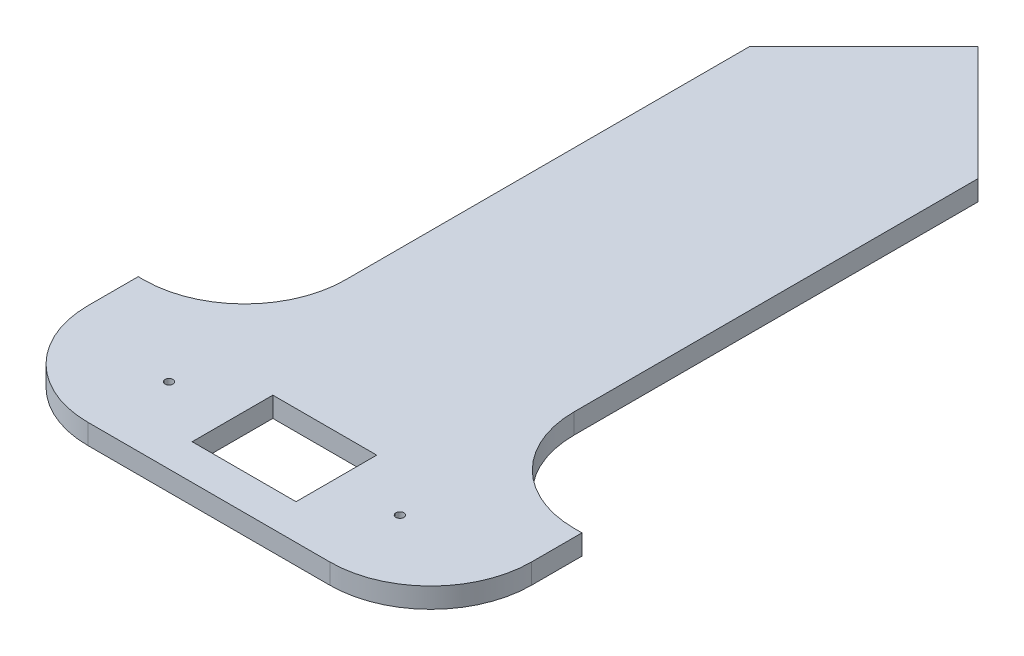
ISO-10303-21;
HEADER;
FILE_DESCRIPTION(('STEP AP214'),'2;1');
FILE_NAME('part.step','',(''),(''),'','','');
FILE_SCHEMA(('AUTOMOTIVE_DESIGN { 1 0 10303 214 1 1 1 1 }'));
ENDSEC;
DATA;
#1=APPLICATION_CONTEXT('core data for automotive mechanical design processes');
#2=APPLICATION_PROTOCOL_DEFINITION('international standard','automotive_design',2000,#1);
#3=PRODUCT_CONTEXT('',#1,'mechanical');
#4=PRODUCT('Part','Part','',(#3));
#5=PRODUCT_RELATED_PRODUCT_CATEGORY('part','',(#4));
#6=PRODUCT_DEFINITION_FORMATION('','',#4);
#7=PRODUCT_DEFINITION_CONTEXT('part definition',#1,'design');
#8=PRODUCT_DEFINITION('design','',#6,#7);
#9=PRODUCT_DEFINITION_SHAPE('','',#8);
#10=(LENGTH_UNIT() NAMED_UNIT(*) SI_UNIT(.MILLI.,.METRE.));
#11=(NAMED_UNIT(*) PLANE_ANGLE_UNIT() SI_UNIT($,.RADIAN.));
#12=(NAMED_UNIT(*) SI_UNIT($,.STERADIAN.) SOLID_ANGLE_UNIT());
#13=UNCERTAINTY_MEASURE_WITH_UNIT(LENGTH_MEASURE(1.E-05),#10,'distance_accuracy_value','');
#14=(GEOMETRIC_REPRESENTATION_CONTEXT(3) GLOBAL_UNCERTAINTY_ASSIGNED_CONTEXT((#13)) GLOBAL_UNIT_ASSIGNED_CONTEXT((#10,
#11,#12)) REPRESENTATION_CONTEXT('',''));
#15=CARTESIAN_POINT('',(0.,0.,0.));
#16=DIRECTION('',(0.,0.,1.));
#17=DIRECTION('',(1.,0.,0.));
#18=AXIS2_PLACEMENT_3D('',#15,#16,#17);
#19=CARTESIAN_POINT('',(0.,0.,0.));
#20=DIRECTION('',(0.,1.,0.));
#21=DIRECTION('',(0.,0.,1.));
#22=AXIS2_PLACEMENT_3D('',#19,#20,#21);
#23=PLANE('',#22);
#24=DIRECTION('',(1.,0.,0.));
#25=VECTOR('',#24,1.);
#26=CARTESIAN_POINT('',(-5.15,0.,4.));
#27=LINE('',#26,#25);
#28=CARTESIAN_POINT('',(-5.15,0.,4.));
#29=VERTEX_POINT('',#28);
#30=CARTESIAN_POINT('',(5.15,0.,4.));
#31=VERTEX_POINT('',#30);
#32=EDGE_CURVE('E223',#29,#31,#27,.T.);
#33=ORIENTED_EDGE('',*,*,#32,.T.);
#34=DIRECTION('',(0.,0.,-1.));
#35=VECTOR('',#34,1.);
#36=CARTESIAN_POINT('',(5.15,0.,-4.));
#37=LINE('',#36,#35);
#38=CARTESIAN_POINT('',(5.15,0.,-4.));
#39=VERTEX_POINT('',#38);
#40=EDGE_CURVE('E213',#31,#39,#37,.T.);
#41=ORIENTED_EDGE('',*,*,#40,.T.);
#42=DIRECTION('',(-1.,0.,0.));
#43=VECTOR('',#42,1.);
#44=CARTESIAN_POINT('',(-5.15,0.,-4.));
#45=LINE('',#44,#43);
#46=CARTESIAN_POINT('',(-5.15,0.,-4.));
#47=VERTEX_POINT('',#46);
#48=EDGE_CURVE('E216',#39,#47,#45,.T.);
#49=ORIENTED_EDGE('',*,*,#48,.T.);
#50=DIRECTION('',(0.,0.,1.));
#51=VECTOR('',#50,1.);
#52=CARTESIAN_POINT('',(-5.15,0.,-4.));
#53=LINE('',#52,#51);
#54=EDGE_CURVE('E220',#47,#29,#53,.T.);
#55=ORIENTED_EDGE('',*,*,#54,.T.);
#56=EDGE_LOOP('',(#33,#41,#49,#55));
#57=FACE_BOUND('',#56,.T.);
#58=CARTESIAN_POINT('',(-11.45,0.,0.));
#59=DIRECTION('',(0.,1.,0.));
#60=DIRECTION('',(0.,0.,1.));
#61=AXIS2_PLACEMENT_3D('',#58,#59,#60);
#62=CIRCLE('',#61,0.4);
#63=CARTESIAN_POINT('',(-11.45,0.,0.400000000000001));
#64=VERTEX_POINT('',#63);
#65=EDGE_CURVE('E207',#64,#64,#62,.T.);
#66=ORIENTED_EDGE('',*,*,#65,.T.);
#67=EDGE_LOOP('',(#66));
#68=FACE_BOUND('',#67,.T.);
#69=CARTESIAN_POINT('',(11.45,0.,0.));
#70=DIRECTION('',(0.,-1.,0.));
#71=DIRECTION('',(0.,0.,1.));
#72=AXIS2_PLACEMENT_3D('',#69,#70,#71);
#73=CIRCLE('',#72,0.4);
#74=CARTESIAN_POINT('',(11.45,0.,0.400000000000001));
#75=VERTEX_POINT('',#74);
#76=EDGE_CURVE('E201',#75,#75,#73,.T.);
#77=ORIENTED_EDGE('',*,*,#76,.F.);
#78=EDGE_LOOP('',(#77));
#79=FACE_BOUND('',#78,.T.);
#80=DIRECTION('',(0.,0.,-1.));
#81=VECTOR('',#80,1.);
#82=CARTESIAN_POINT('',(22.,0.,-7.5));
#83=LINE('',#82,#81);
#84=CARTESIAN_POINT('',(22.,0.,-2.50000000000001));
#85=VERTEX_POINT('',#84);
#86=CARTESIAN_POINT('',(22.,0.,-7.5));
#87=VERTEX_POINT('',#86);
#88=EDGE_CURVE('E238',#85,#87,#83,.T.);
#89=ORIENTED_EDGE('',*,*,#88,.F.);
#90=CARTESIAN_POINT('',(12.,0.,-2.5));
#91=DIRECTION('',(0.,1.,0.));
#92=DIRECTION('',(0.,0.,1.));
#93=AXIS2_PLACEMENT_3D('',#90,#91,#92);
#94=CIRCLE('',#93,10.);
#95=CARTESIAN_POINT('',(12.,0.,7.5));
#96=VERTEX_POINT('',#95);
#97=EDGE_CURVE('E293',#85,#96,#94,.F.);
#98=ORIENTED_EDGE('',*,*,#97,.T.);
#99=DIRECTION('',(1.,0.,0.));
#100=VECTOR('',#99,1.);
#101=CARTESIAN_POINT('',(-22.,0.,7.5));
#102=LINE('',#101,#100);
#103=CARTESIAN_POINT('',(-12.,0.,7.5));
#104=VERTEX_POINT('',#103);
#105=EDGE_CURVE('E248',#104,#96,#102,.T.);
#106=ORIENTED_EDGE('',*,*,#105,.F.);
#107=CARTESIAN_POINT('',(-12.,0.,-2.5));
#108=DIRECTION('',(0.,1.,0.));
#109=DIRECTION('',(0.,0.,1.));
#110=AXIS2_PLACEMENT_3D('',#107,#108,#109);
#111=CIRCLE('',#110,10.);
#112=CARTESIAN_POINT('',(-22.,0.,-2.5));
#113=VERTEX_POINT('',#112);
#114=EDGE_CURVE('E291',#104,#113,#111,.F.);
#115=ORIENTED_EDGE('',*,*,#114,.T.);
#116=DIRECTION('',(0.,0.,1.));
#117=VECTOR('',#116,1.);
#118=CARTESIAN_POINT('',(-22.,0.,-7.5));
#119=LINE('',#118,#117);
#120=CARTESIAN_POINT('',(-22.,0.,-7.5));
#121=VERTEX_POINT('',#120);
#122=EDGE_CURVE('E262',#121,#113,#119,.T.);
#123=ORIENTED_EDGE('',*,*,#122,.F.);
#124=DIRECTION('',(-1.,0.,0.));
#125=VECTOR('',#124,1.);
#126=CARTESIAN_POINT('',(-22.,0.,-7.5));
#127=LINE('',#126,#125);
#128=CARTESIAN_POINT('',(-21.45,0.,-7.5));
#129=VERTEX_POINT('',#128);
#130=EDGE_CURVE('E258',#129,#121,#127,.T.);
#131=ORIENTED_EDGE('',*,*,#130,.F.);
#132=CARTESIAN_POINT('',(-21.45,0.,-17.5));
#133=DIRECTION('',(0.,1.,0.));
#134=DIRECTION('',(0.,0.,1.));
#135=AXIS2_PLACEMENT_3D('',#132,#133,#134);
#136=CIRCLE('',#135,10.);
#137=CARTESIAN_POINT('',(-11.45,0.,-17.5));
#138=VERTEX_POINT('',#137);
#139=EDGE_CURVE('E285',#129,#138,#136,.T.);
#140=ORIENTED_EDGE('',*,*,#139,.T.);
#141=DIRECTION('',(0.,0.,1.));
#142=VECTOR('',#141,1.);
#143=CARTESIAN_POINT('',(-11.45,0.,-7.5));
#144=LINE('',#143,#142);
#145=CARTESIAN_POINT('',(-11.45,0.,-57.5517434185729));
#146=VERTEX_POINT('',#145);
#147=EDGE_CURVE('E171',#146,#138,#144,.T.);
#148=ORIENTED_EDGE('',*,*,#147,.F.);
#149=DIRECTION('',(-0.707106781186541,0.,0.707106781186554));
#150=VECTOR('',#149,1.);
#151=CARTESIAN_POINT('',(-0.116701530311687,0.,-68.8850418882614));
#152=LINE('',#151,#150);
#153=CARTESIAN_POINT('',(-0.116701530311693,0.,-68.8850418882614));
#154=VERTEX_POINT('',#153);
#155=EDGE_CURVE('E178',#154,#146,#152,.T.);
#156=ORIENTED_EDGE('',*,*,#155,.F.);
#157=DIRECTION('',(0.707106781186556,0.,0.707106781186539));
#158=VECTOR('',#157,1.);
#159=CARTESIAN_POINT('',(-0.116701530311691,0.,-68.8850418882614));
#160=LINE('',#159,#158);
#161=CARTESIAN_POINT('',(11.2165969393766,0.,-57.5517434185733));
#162=VERTEX_POINT('',#161);
#163=EDGE_CURVE('E174',#154,#162,#160,.T.);
#164=ORIENTED_EDGE('',*,*,#163,.T.);
#165=DIRECTION('',(0.,0.,-1.));
#166=VECTOR('',#165,1.);
#167=CARTESIAN_POINT('',(11.2165969393766,0.,-7.5));
#168=LINE('',#167,#166);
#169=CARTESIAN_POINT('',(11.2165969393766,0.,-17.5));
#170=VERTEX_POINT('',#169);
#171=EDGE_CURVE('E159',#170,#162,#168,.T.);
#172=ORIENTED_EDGE('',*,*,#171,.F.);
#173=CARTESIAN_POINT('',(21.2165969393766,0.,-17.5));
#174=DIRECTION('',(0.,1.,0.));
#175=DIRECTION('',(0.,0.,1.));
#176=AXIS2_PLACEMENT_3D('',#173,#174,#175);
#177=CIRCLE('',#176,10.);
#178=CARTESIAN_POINT('',(21.2165969393766,0.,-7.5));
#179=VERTEX_POINT('',#178);
#180=EDGE_CURVE('E281',#170,#179,#177,.T.);
#181=ORIENTED_EDGE('',*,*,#180,.T.);
#182=EDGE_CURVE('E259',#87,#179,#127,.T.);
#183=ORIENTED_EDGE('',*,*,#182,.F.);
#184=EDGE_LOOP('',(#89,#98,#106,#115,#123,#131,#140,#148,#156,#164,#172,#181,#183));
#185=FACE_BOUND('',#184,.T.);
#186=ADVANCED_FACE('F39',(#57,#68,#79,#185),#23,.F.);
#187=CARTESIAN_POINT('',(0.,2.,0.));
#188=DIRECTION('',(0.,1.,0.));
#189=DIRECTION('',(0.,0.,1.));
#190=AXIS2_PLACEMENT_3D('',#187,#188,#189);
#191=PLANE('',#190);
#192=DIRECTION('',(1.,0.,0.));
#193=VECTOR('',#192,1.);
#194=CARTESIAN_POINT('',(-22.,2.,7.5));
#195=LINE('',#194,#193);
#196=CARTESIAN_POINT('',(-12.,2.,7.5));
#197=VERTEX_POINT('',#196);
#198=CARTESIAN_POINT('',(12.,2.,7.5));
#199=VERTEX_POINT('',#198);
#200=EDGE_CURVE('E254',#197,#199,#195,.T.);
#201=ORIENTED_EDGE('',*,*,#200,.T.);
#202=CARTESIAN_POINT('',(12.,2.,-2.5));
#203=DIRECTION('',(0.,1.,0.));
#204=DIRECTION('',(0.,0.,1.));
#205=AXIS2_PLACEMENT_3D('',#202,#203,#204);
#206=CIRCLE('',#205,10.);
#207=CARTESIAN_POINT('',(22.,2.,-2.50000000000001));
#208=VERTEX_POINT('',#207);
#209=EDGE_CURVE('E47',#199,#208,#206,.T.);
#210=ORIENTED_EDGE('',*,*,#209,.T.);
#211=DIRECTION('',(0.,0.,-1.));
#212=VECTOR('',#211,1.);
#213=CARTESIAN_POINT('',(22.,2.,-7.5));
#214=LINE('',#213,#212);
#215=CARTESIAN_POINT('',(22.,2.,-7.5));
#216=VERTEX_POINT('',#215);
#217=EDGE_CURVE('E245',#208,#216,#214,.T.);
#218=ORIENTED_EDGE('',*,*,#217,.T.);
#219=DIRECTION('',(-1.,0.,0.));
#220=VECTOR('',#219,1.);
#221=CARTESIAN_POINT('',(-22.,2.,-7.5));
#222=LINE('',#221,#220);
#223=CARTESIAN_POINT('',(21.2165969393766,2.,-7.5));
#224=VERTEX_POINT('',#223);
#225=EDGE_CURVE('E249',#216,#224,#222,.T.);
#226=ORIENTED_EDGE('',*,*,#225,.T.);
#227=CARTESIAN_POINT('',(21.2165969393766,2.,-17.5));
#228=DIRECTION('',(0.,1.,0.));
#229=DIRECTION('',(0.,0.,1.));
#230=AXIS2_PLACEMENT_3D('',#227,#228,#229);
#231=CIRCLE('',#230,10.);
#232=CARTESIAN_POINT('',(11.2165969393766,2.,-17.5));
#233=VERTEX_POINT('',#232);
#234=EDGE_CURVE('E279',#224,#233,#231,.F.);
#235=ORIENTED_EDGE('',*,*,#234,.T.);
#236=DIRECTION('',(0.,0.,-1.));
#237=VECTOR('',#236,1.);
#238=CARTESIAN_POINT('',(11.2165969393766,2.,-7.5));
#239=LINE('',#238,#237);
#240=CARTESIAN_POINT('',(11.2165969393766,2.,-57.5517434185733));
#241=VERTEX_POINT('',#240);
#242=EDGE_CURVE('E197',#233,#241,#239,.T.);
#243=ORIENTED_EDGE('',*,*,#242,.T.);
#244=DIRECTION('',(0.707106781186556,0.,0.707106781186539));
#245=VECTOR('',#244,1.);
#246=CARTESIAN_POINT('',(-0.116701530311691,2.,-68.8850418882614));
#247=LINE('',#246,#245);
#248=CARTESIAN_POINT('',(-0.116701530311691,2.,-68.8850418882614));
#249=VERTEX_POINT('',#248);
#250=EDGE_CURVE('E185',#249,#241,#247,.T.);
#251=ORIENTED_EDGE('',*,*,#250,.F.);
#252=DIRECTION('',(-0.707106781186541,0.,0.707106781186554));
#253=VECTOR('',#252,1.);
#254=CARTESIAN_POINT('',(-0.116701530311687,2.,-68.8850418882614));
#255=LINE('',#254,#253);
#256=CARTESIAN_POINT('',(-11.45,2.,-57.5517434185729));
#257=VERTEX_POINT('',#256);
#258=EDGE_CURVE('E194',#249,#257,#255,.T.);
#259=ORIENTED_EDGE('',*,*,#258,.T.);
#260=DIRECTION('',(0.,0.,1.));
#261=VECTOR('',#260,1.);
#262=CARTESIAN_POINT('',(-11.45,2.,-7.5));
#263=LINE('',#262,#261);
#264=CARTESIAN_POINT('',(-11.45,2.,-17.5));
#265=VERTEX_POINT('',#264);
#266=EDGE_CURVE('E196',#257,#265,#263,.T.);
#267=ORIENTED_EDGE('',*,*,#266,.T.);
#268=CARTESIAN_POINT('',(-21.45,2.,-17.5));
#269=DIRECTION('',(0.,1.,0.));
#270=DIRECTION('',(0.,0.,1.));
#271=AXIS2_PLACEMENT_3D('',#268,#269,#270);
#272=CIRCLE('',#271,10.);
#273=CARTESIAN_POINT('',(-21.45,2.,-7.5));
#274=VERTEX_POINT('',#273);
#275=EDGE_CURVE('E283',#265,#274,#272,.F.);
#276=ORIENTED_EDGE('',*,*,#275,.T.);
#277=CARTESIAN_POINT('',(-22.,2.,-7.5));
#278=VERTEX_POINT('',#277);
#279=EDGE_CURVE('E247',#274,#278,#222,.T.);
#280=ORIENTED_EDGE('',*,*,#279,.T.);
#281=DIRECTION('',(0.,0.,1.));
#282=VECTOR('',#281,1.);
#283=CARTESIAN_POINT('',(-22.,2.,-7.5));
#284=LINE('',#283,#282);
#285=CARTESIAN_POINT('',(-22.,2.,-2.5));
#286=VERTEX_POINT('',#285);
#287=EDGE_CURVE('E252',#278,#286,#284,.T.);
#288=ORIENTED_EDGE('',*,*,#287,.T.);
#289=CARTESIAN_POINT('',(-12.,2.,-2.5));
#290=DIRECTION('',(0.,1.,0.));
#291=DIRECTION('',(0.,0.,1.));
#292=AXIS2_PLACEMENT_3D('',#289,#290,#291);
#293=CIRCLE('',#292,10.);
#294=EDGE_CURVE('E299',#286,#197,#293,.T.);
#295=ORIENTED_EDGE('',*,*,#294,.T.);
#296=EDGE_LOOP('',(#201,#210,#218,#226,#235,#243,#251,#259,#267,#276,#280,#288,#295));
#297=FACE_BOUND('',#296,.T.);
#298=CARTESIAN_POINT('',(11.45,2.,0.));
#299=DIRECTION('',(0.,-1.,0.));
#300=DIRECTION('',(0.,0.,1.));
#301=AXIS2_PLACEMENT_3D('',#298,#299,#300);
#302=CIRCLE('',#301,0.4);
#303=CARTESIAN_POINT('',(11.45,2.,0.400000000000001));
#304=VERTEX_POINT('',#303);
#305=EDGE_CURVE('E170',#304,#304,#302,.T.);
#306=ORIENTED_EDGE('',*,*,#305,.T.);
#307=EDGE_LOOP('',(#306));
#308=FACE_BOUND('',#307,.T.);
#309=CARTESIAN_POINT('',(-11.45,2.,0.));
#310=DIRECTION('',(0.,1.,0.));
#311=DIRECTION('',(0.,0.,1.));
#312=AXIS2_PLACEMENT_3D('',#309,#310,#311);
#313=CIRCLE('',#312,0.4);
#314=CARTESIAN_POINT('',(-11.45,2.,0.400000000000001));
#315=VERTEX_POINT('',#314);
#316=EDGE_CURVE('E204',#315,#315,#313,.T.);
#317=ORIENTED_EDGE('',*,*,#316,.F.);
#318=EDGE_LOOP('',(#317));
#319=FACE_BOUND('',#318,.T.);
#320=DIRECTION('',(0.,0.,-1.));
#321=VECTOR('',#320,1.);
#322=CARTESIAN_POINT('',(5.15,2.,-4.));
#323=LINE('',#322,#321);
#324=CARTESIAN_POINT('',(5.15,2.,4.));
#325=VERTEX_POINT('',#324);
#326=CARTESIAN_POINT('',(5.15,2.,-4.));
#327=VERTEX_POINT('',#326);
#328=EDGE_CURVE('E210',#325,#327,#323,.T.);
#329=ORIENTED_EDGE('',*,*,#328,.F.);
#330=DIRECTION('',(1.,0.,0.));
#331=VECTOR('',#330,1.);
#332=CARTESIAN_POINT('',(-5.15,2.,4.));
#333=LINE('',#332,#331);
#334=CARTESIAN_POINT('',(-5.15,2.,4.));
#335=VERTEX_POINT('',#334);
#336=EDGE_CURVE('E217',#335,#325,#333,.T.);
#337=ORIENTED_EDGE('',*,*,#336,.F.);
#338=DIRECTION('',(0.,0.,1.));
#339=VECTOR('',#338,1.);
#340=CARTESIAN_POINT('',(-5.15,2.,-4.));
#341=LINE('',#340,#339);
#342=CARTESIAN_POINT('',(-5.15,2.,-4.));
#343=VERTEX_POINT('',#342);
#344=EDGE_CURVE('E231',#343,#335,#341,.T.);
#345=ORIENTED_EDGE('',*,*,#344,.F.);
#346=DIRECTION('',(-1.,0.,0.));
#347=VECTOR('',#346,1.);
#348=CARTESIAN_POINT('',(-5.15,2.,-4.));
#349=LINE('',#348,#347);
#350=EDGE_CURVE('E228',#327,#343,#349,.T.);
#351=ORIENTED_EDGE('',*,*,#350,.F.);
#352=EDGE_LOOP('',(#329,#337,#345,#351));
#353=FACE_BOUND('',#352,.T.);
#354=ADVANCED_FACE('F303',(#297,#308,#319,#353),#191,.T.);
#355=CARTESIAN_POINT('',(-11.45,0.,-7.5));
#356=DIRECTION('',(-1.,0.,0.));
#357=DIRECTION('',(0.,0.,1.));
#358=AXIS2_PLACEMENT_3D('',#355,#356,#357);
#359=PLANE('',#358);
#360=ORIENTED_EDGE('',*,*,#266,.F.);
#361=DIRECTION('',(0.,-1.,0.));
#362=VECTOR('',#361,1.);
#363=CARTESIAN_POINT('',(-11.45,112.217644233689,-57.5517434185729));
#364=LINE('',#363,#362);
#365=EDGE_CURVE('E190',#257,#146,#364,.T.);
#366=ORIENTED_EDGE('',*,*,#365,.T.);
#367=ORIENTED_EDGE('',*,*,#147,.T.);
#368=DIRECTION('',(0.,1.,0.));
#369=VECTOR('',#368,1.);
#370=CARTESIAN_POINT('',(-11.45,0.,-17.5));
#371=LINE('',#370,#369);
#372=EDGE_CURVE('E274',#138,#265,#371,.T.);
#373=ORIENTED_EDGE('',*,*,#372,.T.);
#374=EDGE_LOOP('',(#360,#366,#367,#373));
#375=FACE_BOUND('',#374,.T.);
#376=ADVANCED_FACE('F333',(#375),#359,.T.);
#377=CARTESIAN_POINT('',(-22.,2.,-7.5));
#378=DIRECTION('',(0.,0.,1.));
#379=DIRECTION('',(1.,0.,0.));
#380=AXIS2_PLACEMENT_3D('',#377,#378,#379);
#381=PLANE('',#380);
#382=ORIENTED_EDGE('',*,*,#279,.F.);
#383=DIRECTION('',(0.,1.,0.));
#384=VECTOR('',#383,1.);
#385=CARTESIAN_POINT('',(-21.45,2.,-7.5));
#386=LINE('',#385,#384);
#387=EDGE_CURVE('E277',#274,#129,#386,.F.);
#388=ORIENTED_EDGE('',*,*,#387,.T.);
#389=ORIENTED_EDGE('',*,*,#130,.T.);
#390=DIRECTION('',(0.,-1.,0.));
#391=VECTOR('',#390,1.);
#392=CARTESIAN_POINT('',(-22.,2.,-7.5));
#393=LINE('',#392,#391);
#394=EDGE_CURVE('E256',#278,#121,#393,.T.);
#395=ORIENTED_EDGE('',*,*,#394,.F.);
#396=EDGE_LOOP('',(#382,#388,#389,#395));
#397=FACE_BOUND('',#396,.T.);
#398=ADVANCED_FACE('F324',(#397),#381,.F.);
#399=CARTESIAN_POINT('',(22.,2.,-7.5));
#400=DIRECTION('',(-1.,0.,0.));
#401=DIRECTION('',(0.,0.,1.));
#402=AXIS2_PLACEMENT_3D('',#399,#400,#401);
#403=PLANE('',#402);
#404=ORIENTED_EDGE('',*,*,#217,.F.);
#405=DIRECTION('',(0.,-1.,0.));
#406=VECTOR('',#405,1.);
#407=CARTESIAN_POINT('',(22.,2.,-2.50000000000001));
#408=LINE('',#407,#406);
#409=EDGE_CURVE('E288',#208,#85,#408,.T.);
#410=ORIENTED_EDGE('',*,*,#409,.T.);
#411=ORIENTED_EDGE('',*,*,#88,.T.);
#412=DIRECTION('',(0.,-1.,0.));
#413=VECTOR('',#412,1.);
#414=CARTESIAN_POINT('',(22.,2.,-7.5));
#415=LINE('',#414,#413);
#416=EDGE_CURVE('E267',#216,#87,#415,.T.);
#417=ORIENTED_EDGE('',*,*,#416,.F.);
#418=EDGE_LOOP('',(#404,#410,#411,#417));
#419=FACE_BOUND('',#418,.T.);
#420=ADVANCED_FACE('F310',(#419),#403,.F.);
#421=ORIENTED_EDGE('',*,*,#182,.T.);
#422=DIRECTION('',(0.,1.,0.));
#423=VECTOR('',#422,1.);
#424=CARTESIAN_POINT('',(21.2165969393766,2.,-7.5));
#425=LINE('',#424,#423);
#426=EDGE_CURVE('E270',#179,#224,#425,.T.);
#427=ORIENTED_EDGE('',*,*,#426,.T.);
#428=ORIENTED_EDGE('',*,*,#225,.F.);
#429=ORIENTED_EDGE('',*,*,#416,.T.);
#430=EDGE_LOOP('',(#421,#427,#428,#429));
#431=FACE_BOUND('',#430,.T.);
#432=ADVANCED_FACE('F342',(#431),#381,.F.);
#433=CARTESIAN_POINT('',(-22.,2.,-7.5));
#434=DIRECTION('',(1.,0.,0.));
#435=DIRECTION('',(0.,0.,-1.));
#436=AXIS2_PLACEMENT_3D('',#433,#434,#435);
#437=PLANE('',#436);
#438=ORIENTED_EDGE('',*,*,#122,.T.);
#439=DIRECTION('',(0.,-1.,0.));
#440=VECTOR('',#439,1.);
#441=CARTESIAN_POINT('',(-22.,2.,-2.5));
#442=LINE('',#441,#440);
#443=EDGE_CURVE('E11',#113,#286,#442,.F.);
#444=ORIENTED_EDGE('',*,*,#443,.T.);
#445=ORIENTED_EDGE('',*,*,#287,.F.);
#446=ORIENTED_EDGE('',*,*,#394,.T.);
#447=EDGE_LOOP('',(#438,#444,#445,#446));
#448=FACE_BOUND('',#447,.T.);
#449=ADVANCED_FACE('F320',(#448),#437,.F.);
#450=CARTESIAN_POINT('',(-22.,2.,7.5));
#451=DIRECTION('',(0.,0.,-1.));
#452=DIRECTION('',(-1.,0.,0.));
#453=AXIS2_PLACEMENT_3D('',#450,#451,#452);
#454=PLANE('',#453);
#455=ORIENTED_EDGE('',*,*,#105,.T.);
#456=DIRECTION('',(0.,-1.,0.));
#457=VECTOR('',#456,1.);
#458=CARTESIAN_POINT('',(12.,2.,7.5));
#459=LINE('',#458,#457);
#460=EDGE_CURVE('E60',#96,#199,#459,.F.);
#461=ORIENTED_EDGE('',*,*,#460,.T.);
#462=ORIENTED_EDGE('',*,*,#200,.F.);
#463=DIRECTION('',(0.,-1.,0.));
#464=VECTOR('',#463,1.);
#465=CARTESIAN_POINT('',(-12.,2.,7.5));
#466=LINE('',#465,#464);
#467=EDGE_CURVE('E295',#197,#104,#466,.T.);
#468=ORIENTED_EDGE('',*,*,#467,.T.);
#469=EDGE_LOOP('',(#455,#461,#462,#468));
#470=FACE_BOUND('',#469,.T.);
#471=ADVANCED_FACE('F314',(#470),#454,.F.);
#472=CARTESIAN_POINT('',(5.15,0.,-4.));
#473=DIRECTION('',(1.,0.,0.));
#474=DIRECTION('',(0.,0.,-1.));
#475=AXIS2_PLACEMENT_3D('',#472,#473,#474);
#476=PLANE('',#475);
#477=ORIENTED_EDGE('',*,*,#328,.T.);
#478=DIRECTION('',(0.,1.,0.));
#479=VECTOR('',#478,1.);
#480=CARTESIAN_POINT('',(5.15,0.,-4.));
#481=LINE('',#480,#479);
#482=EDGE_CURVE('E226',#39,#327,#481,.T.);
#483=ORIENTED_EDGE('',*,*,#482,.F.);
#484=ORIENTED_EDGE('',*,*,#40,.F.);
#485=DIRECTION('',(0.,1.,0.));
#486=VECTOR('',#485,1.);
#487=CARTESIAN_POINT('',(5.15,0.,4.));
#488=LINE('',#487,#486);
#489=EDGE_CURVE('E236',#31,#325,#488,.T.);
#490=ORIENTED_EDGE('',*,*,#489,.T.);
#491=EDGE_LOOP('',(#477,#483,#484,#490));
#492=FACE_BOUND('',#491,.T.);
#493=ADVANCED_FACE('F365',(#492),#476,.F.);
#494=CARTESIAN_POINT('',(-5.15,0.,4.));
#495=DIRECTION('',(0.,0.,1.));
#496=DIRECTION('',(1.,0.,0.));
#497=AXIS2_PLACEMENT_3D('',#494,#495,#496);
#498=PLANE('',#497);
#499=ORIENTED_EDGE('',*,*,#336,.T.);
#500=ORIENTED_EDGE('',*,*,#489,.F.);
#501=ORIENTED_EDGE('',*,*,#32,.F.);
#502=DIRECTION('',(0.,1.,0.));
#503=VECTOR('',#502,1.);
#504=CARTESIAN_POINT('',(-5.15,0.,4.));
#505=LINE('',#504,#503);
#506=EDGE_CURVE('E239',#29,#335,#505,.T.);
#507=ORIENTED_EDGE('',*,*,#506,.T.);
#508=EDGE_LOOP('',(#499,#500,#501,#507));
#509=FACE_BOUND('',#508,.T.);
#510=ADVANCED_FACE('F370',(#509),#498,.F.);
#511=CARTESIAN_POINT('',(-5.15,0.,-4.));
#512=DIRECTION('',(-1.,0.,0.));
#513=DIRECTION('',(0.,0.,1.));
#514=AXIS2_PLACEMENT_3D('',#511,#512,#513);
#515=PLANE('',#514);
#516=ORIENTED_EDGE('',*,*,#344,.T.);
#517=ORIENTED_EDGE('',*,*,#506,.F.);
#518=ORIENTED_EDGE('',*,*,#54,.F.);
#519=DIRECTION('',(0.,1.,0.));
#520=VECTOR('',#519,1.);
#521=CARTESIAN_POINT('',(-5.15,0.,-4.));
#522=LINE('',#521,#520);
#523=EDGE_CURVE('E241',#47,#343,#522,.T.);
#524=ORIENTED_EDGE('',*,*,#523,.T.);
#525=EDGE_LOOP('',(#516,#517,#518,#524));
#526=FACE_BOUND('',#525,.T.);
#527=ADVANCED_FACE('F375',(#526),#515,.F.);
#528=CARTESIAN_POINT('',(-5.15,0.,-4.));
#529=DIRECTION('',(0.,0.,-1.));
#530=DIRECTION('',(-1.,0.,0.));
#531=AXIS2_PLACEMENT_3D('',#528,#529,#530);
#532=PLANE('',#531);
#533=ORIENTED_EDGE('',*,*,#350,.T.);
#534=ORIENTED_EDGE('',*,*,#523,.F.);
#535=ORIENTED_EDGE('',*,*,#48,.F.);
#536=ORIENTED_EDGE('',*,*,#482,.T.);
#537=EDGE_LOOP('',(#533,#534,#535,#536));
#538=FACE_BOUND('',#537,.T.);
#539=ADVANCED_FACE('F379',(#538),#532,.F.);
#540=CARTESIAN_POINT('',(-11.45,0.,0.));
#541=DIRECTION('',(0.,1.,0.));
#542=DIRECTION('',(0.,0.,1.));
#543=AXIS2_PLACEMENT_3D('',#540,#541,#542);
#544=CYLINDRICAL_SURFACE('',#543,0.4);
#545=ORIENTED_EDGE('',*,*,#65,.F.);
#546=EDGE_LOOP('',(#545));
#547=FACE_BOUND('',#546,.T.);
#548=ORIENTED_EDGE('',*,*,#316,.T.);
#549=EDGE_LOOP('',(#548));
#550=FACE_BOUND('',#549,.T.);
#551=ADVANCED_FACE('F382',(#547,#550),#544,.F.);
#552=CARTESIAN_POINT('',(11.45,0.,0.));
#553=DIRECTION('',(0.,1.,0.));
#554=DIRECTION('',(0.,0.,1.));
#555=AXIS2_PLACEMENT_3D('',#552,#553,#554);
#556=CYLINDRICAL_SURFACE('',#555,0.4);
#557=ORIENTED_EDGE('',*,*,#76,.T.);
#558=EDGE_LOOP('',(#557));
#559=FACE_BOUND('',#558,.T.);
#560=ORIENTED_EDGE('',*,*,#305,.F.);
#561=EDGE_LOOP('',(#560));
#562=FACE_BOUND('',#561,.T.);
#563=ADVANCED_FACE('F389',(#559,#562),#556,.F.);
#564=CARTESIAN_POINT('',(11.2165969393766,0.,-7.5));
#565=DIRECTION('',(1.,0.,0.));
#566=DIRECTION('',(0.,0.,-1.));
#567=AXIS2_PLACEMENT_3D('',#564,#565,#566);
#568=PLANE('',#567);
#569=DIRECTION('',(0.,-1.,0.));
#570=VECTOR('',#569,1.);
#571=CARTESIAN_POINT('',(11.2165969393766,114.717644233689,-57.5517434185733));
#572=LINE('',#571,#570);
#573=EDGE_CURVE('E164',#241,#162,#572,.T.);
#574=ORIENTED_EDGE('',*,*,#573,.F.);
#575=ORIENTED_EDGE('',*,*,#242,.F.);
#576=DIRECTION('',(0.,1.,0.));
#577=VECTOR('',#576,1.);
#578=CARTESIAN_POINT('',(11.2165969393766,0.,-17.5));
#579=LINE('',#578,#577);
#580=EDGE_CURVE('E167',#233,#170,#579,.F.);
#581=ORIENTED_EDGE('',*,*,#580,.T.);
#582=ORIENTED_EDGE('',*,*,#171,.T.);
#583=EDGE_LOOP('',(#574,#575,#581,#582));
#584=FACE_BOUND('',#583,.T.);
#585=ADVANCED_FACE('F161',(#584),#568,.T.);
#586=CARTESIAN_POINT('',(21.2165969393766,2.,-17.5));
#587=DIRECTION('',(0.,1.,0.));
#588=DIRECTION('',(0.,0.,1.));
#589=AXIS2_PLACEMENT_3D('',#586,#587,#588);
#590=CYLINDRICAL_SURFACE('',#589,10.);
#591=ORIENTED_EDGE('',*,*,#180,.F.);
#592=ORIENTED_EDGE('',*,*,#580,.F.);
#593=ORIENTED_EDGE('',*,*,#234,.F.);
#594=ORIENTED_EDGE('',*,*,#426,.F.);
#595=EDGE_LOOP('',(#591,#592,#593,#594));
#596=FACE_BOUND('',#595,.T.);
#597=ADVANCED_FACE('F339',(#596),#590,.F.);
#598=CARTESIAN_POINT('',(-21.45,0.,-17.5));
#599=DIRECTION('',(0.,1.,0.));
#600=DIRECTION('',(0.,0.,1.));
#601=AXIS2_PLACEMENT_3D('',#598,#599,#600);
#602=CYLINDRICAL_SURFACE('',#601,10.);
#603=ORIENTED_EDGE('',*,*,#139,.F.);
#604=ORIENTED_EDGE('',*,*,#387,.F.);
#605=ORIENTED_EDGE('',*,*,#275,.F.);
#606=ORIENTED_EDGE('',*,*,#372,.F.);
#607=EDGE_LOOP('',(#603,#604,#605,#606));
#608=FACE_BOUND('',#607,.T.);
#609=ADVANCED_FACE('F329',(#608),#602,.F.);
#610=CARTESIAN_POINT('',(-0.116701530311687,112.217644233689,-68.8850418882614));
#611=DIRECTION('',(0.707106781186554,0.,0.707106781186541));
#612=DIRECTION('',(0.707106781186541,0.,-0.707106781186554));
#613=AXIS2_PLACEMENT_3D('',#610,#611,#612);
#614=PLANE('',#613);
#615=DIRECTION('',(0.,-1.,0.));
#616=VECTOR('',#615,1.);
#617=CARTESIAN_POINT('',(-0.116701530311687,112.217644233689,-68.8850418882614));
#618=LINE('',#617,#616);
#619=EDGE_CURVE('E192',#249,#154,#618,.T.);
#620=ORIENTED_EDGE('',*,*,#619,.T.);
#621=ORIENTED_EDGE('',*,*,#155,.T.);
#622=ORIENTED_EDGE('',*,*,#365,.F.);
#623=ORIENTED_EDGE('',*,*,#258,.F.);
#624=EDGE_LOOP('',(#620,#621,#622,#623));
#625=FACE_BOUND('',#624,.T.);
#626=ADVANCED_FACE('F336',(#625),#614,.F.);
#627=CARTESIAN_POINT('',(-0.116701530311691,114.717644233689,-68.8850418882614));
#628=DIRECTION('',(0.707106781186539,0.,-0.707106781186556));
#629=DIRECTION('',(-0.707106781186556,0.,-0.707106781186539));
#630=AXIS2_PLACEMENT_3D('',#627,#628,#629);
#631=PLANE('',#630);
#632=ORIENTED_EDGE('',*,*,#619,.F.);
#633=ORIENTED_EDGE('',*,*,#250,.T.);
#634=ORIENTED_EDGE('',*,*,#573,.T.);
#635=ORIENTED_EDGE('',*,*,#163,.F.);
#636=EDGE_LOOP('',(#632,#633,#634,#635));
#637=FACE_BOUND('',#636,.T.);
#638=ADVANCED_FACE('F184',(#637),#631,.T.);
#639=CARTESIAN_POINT('',(12.,2.,-2.5));
#640=DIRECTION('',(0.,-1.,0.));
#641=DIRECTION('',(0.,0.,-1.));
#642=AXIS2_PLACEMENT_3D('',#639,#640,#641);
#643=CYLINDRICAL_SURFACE('',#642,10.);
#644=ORIENTED_EDGE('',*,*,#209,.F.);
#645=ORIENTED_EDGE('',*,*,#460,.F.);
#646=ORIENTED_EDGE('',*,*,#97,.F.);
#647=ORIENTED_EDGE('',*,*,#409,.F.);
#648=EDGE_LOOP('',(#644,#645,#646,#647));
#649=FACE_BOUND('',#648,.T.);
#650=ADVANCED_FACE('F311',(#649),#643,.T.);
#651=CARTESIAN_POINT('',(-12.,2.,-2.5));
#652=DIRECTION('',(0.,-1.,0.));
#653=DIRECTION('',(0.,0.,-1.));
#654=AXIS2_PLACEMENT_3D('',#651,#652,#653);
#655=CYLINDRICAL_SURFACE('',#654,10.);
#656=ORIENTED_EDGE('',*,*,#294,.F.);
#657=ORIENTED_EDGE('',*,*,#443,.F.);
#658=ORIENTED_EDGE('',*,*,#114,.F.);
#659=ORIENTED_EDGE('',*,*,#467,.F.);
#660=EDGE_LOOP('',(#656,#657,#658,#659));
#661=FACE_BOUND('',#660,.T.);
#662=ADVANCED_FACE('F41',(#661),#655,.T.);
#663=CLOSED_SHELL('',(#186,#354,#376,#398,#420,#432,#449,#471,#493,#510,#527,#539,#551,#563,
#585,#597,#609,#626,#638,#650,#662));
#664=MANIFOLD_SOLID_BREP('B2',#663);
#665=ADVANCED_BREP_SHAPE_REPRESENTATION('',(#18,#664),#14);
#666=SHAPE_DEFINITION_REPRESENTATION(#9,#665);
ENDSEC;
END-ISO-10303-21;
